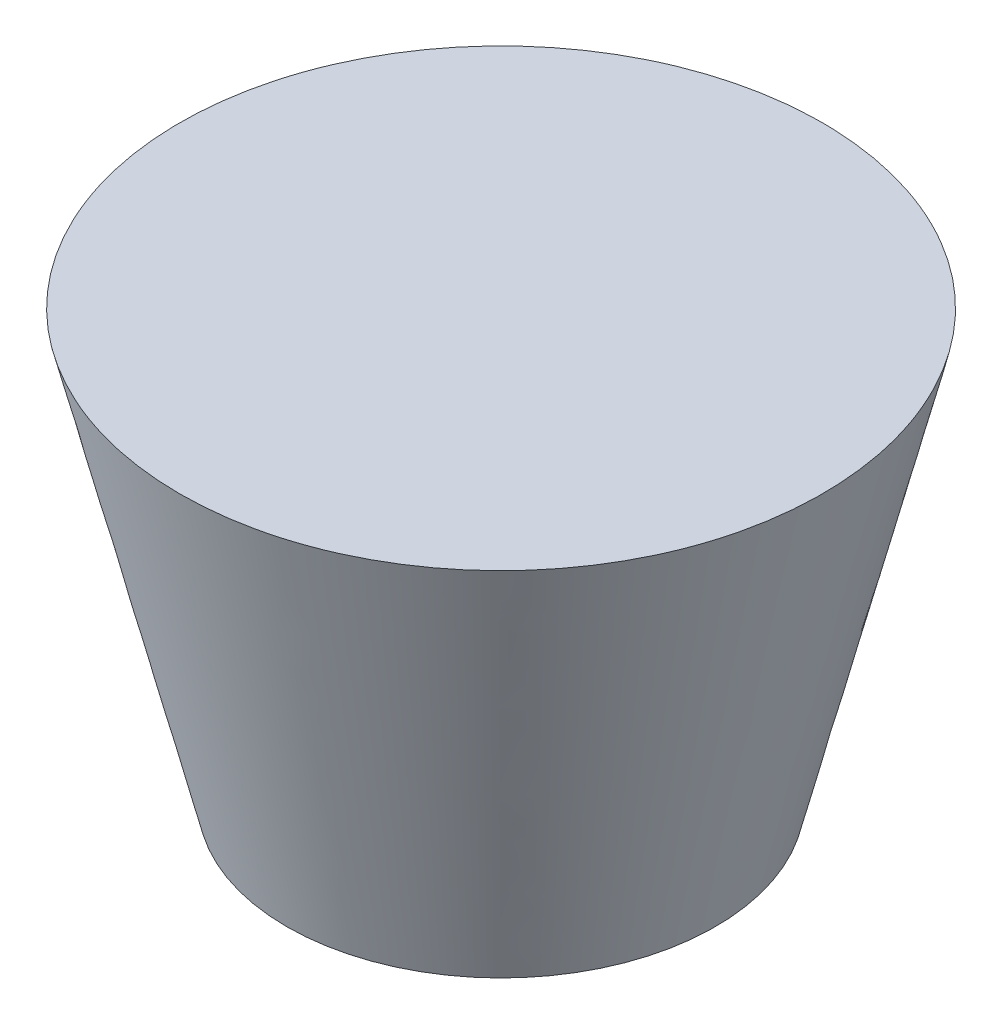
ISO-10303-21;
HEADER;
FILE_DESCRIPTION(('STEP AP214'),'2;1');
FILE_NAME('part.step','',(''),(''),'','','');
FILE_SCHEMA(('AUTOMOTIVE_DESIGN { 1 0 10303 214 1 1 1 1 }'));
ENDSEC;
DATA;
#1=APPLICATION_CONTEXT('core data for automotive mechanical design processes');
#2=APPLICATION_PROTOCOL_DEFINITION('international standard','automotive_design',2000,#1);
#3=PRODUCT_CONTEXT('',#1,'mechanical');
#4=PRODUCT('Part','Part','',(#3));
#5=PRODUCT_RELATED_PRODUCT_CATEGORY('part','',(#4));
#6=PRODUCT_DEFINITION_FORMATION('','',#4);
#7=PRODUCT_DEFINITION_CONTEXT('part definition',#1,'design');
#8=PRODUCT_DEFINITION('design','',#6,#7);
#9=PRODUCT_DEFINITION_SHAPE('','',#8);
#10=(LENGTH_UNIT() NAMED_UNIT(*) SI_UNIT(.MILLI.,.METRE.));
#11=(NAMED_UNIT(*) PLANE_ANGLE_UNIT() SI_UNIT($,.RADIAN.));
#12=(NAMED_UNIT(*) SI_UNIT($,.STERADIAN.) SOLID_ANGLE_UNIT());
#13=UNCERTAINTY_MEASURE_WITH_UNIT(LENGTH_MEASURE(1.E-05),#10,'distance_accuracy_value','');
#14=(GEOMETRIC_REPRESENTATION_CONTEXT(3) GLOBAL_UNCERTAINTY_ASSIGNED_CONTEXT((#13)) GLOBAL_UNIT_ASSIGNED_CONTEXT((#10,
#11,#12)) REPRESENTATION_CONTEXT('',''));
#15=CARTESIAN_POINT('',(0.,0.,0.));
#16=DIRECTION('',(0.,0.,1.));
#17=DIRECTION('',(1.,0.,0.));
#18=AXIS2_PLACEMENT_3D('',#15,#16,#17);
#19=CARTESIAN_POINT('',(0.,0.,0.));
#20=DIRECTION('',(0.,1.,0.));
#21=DIRECTION('',(0.,0.,1.));
#22=AXIS2_PLACEMENT_3D('',#19,#20,#21);
#23=PLANE('',#22);
#24=CARTESIAN_POINT('',(0.,0.,0.));
#25=DIRECTION('',(0.,1.,0.));
#26=DIRECTION('',(0.,0.,1.));
#27=AXIS2_PLACEMENT_3D('',#24,#25,#26);
#28=CIRCLE('',#27,10.);
#29=CARTESIAN_POINT('',(0.,0.,10.));
#30=VERTEX_POINT('',#29);
#31=EDGE_CURVE('E12',#30,#30,#28,.T.);
#32=ORIENTED_EDGE('',*,*,#31,.F.);
#33=EDGE_LOOP('',(#32));
#34=FACE_BOUND('',#33,.T.);
#35=ADVANCED_FACE('F56',(#34),#23,.F.);
#36=CARTESIAN_POINT('',(0.,20.,0.));
#37=DIRECTION('',(0.,1.,0.));
#38=DIRECTION('',(0.,0.,1.));
#39=AXIS2_PLACEMENT_3D('',#36,#37,#38);
#40=PLANE('',#39);
#41=CARTESIAN_POINT('',(0.,20.,0.));
#42=DIRECTION('',(0.,1.,0.));
#43=DIRECTION('',(0.,0.,1.));
#44=AXIS2_PLACEMENT_3D('',#41,#42,#43);
#45=CIRCLE('',#44,15.);
#46=CARTESIAN_POINT('',(0.,20.,15.));
#47=VERTEX_POINT('',#46);
#48=EDGE_CURVE('E64',#47,#47,#45,.T.);
#49=ORIENTED_EDGE('',*,*,#48,.T.);
#50=EDGE_LOOP('',(#49));
#51=FACE_BOUND('',#50,.T.);
#52=ADVANCED_FACE('F88',(#51),#40,.T.);
#53=CARTESIAN_POINT('',(-14.9863897847526,20.,0.));
#54=CARTESIAN_POINT('',(-13.3242598565017,13.3333333333333,0.));
#55=CARTESIAN_POINT('',(-11.6621299282509,6.66666666666666,0.));
#56=CARTESIAN_POINT('',(-10.,0.,0.));
#57=CARTESIAN_POINT('',(-14.9863897847526,20.,-0.413936257442323));
#58=CARTESIAN_POINT('',(-13.3242598565017,13.3333333333333,-0.367943339948732));
#59=CARTESIAN_POINT('',(-11.6621299282509,6.66666666666666,-0.32195042245514));
#60=CARTESIAN_POINT('',(-10.,0.,-0.275957504961552));
#61=CARTESIAN_POINT('',(-14.9527834104968,20.,-1.2340215208385));
#62=CARTESIAN_POINT('',(-13.2943875238299,13.3333333333333,-1.09690801852312));
#63=CARTESIAN_POINT('',(-11.635991637163,6.66666666666666,-0.959794516207726));
#64=CARTESIAN_POINT('',(-9.97759575049615,0.,-0.82268101389234));
#65=CARTESIAN_POINT('',(-14.8054275947609,20.,-2.43691479305229));
#66=CARTESIAN_POINT('',(-13.1634045765091,13.3333333333333,-2.16614648271315));
#67=CARTESIAN_POINT('',(-11.5213815582574,6.66666666666666,-1.89537817237401));
#68=CARTESIAN_POINT('',(-9.87935854000558,0.,-1.62460986203487));
#69=CARTESIAN_POINT('',(-14.564998393088,20.,-3.6087005739705));
#70=CARTESIAN_POINT('',(-12.9496897305776,13.3333333333333,-3.20773384352933));
#71=CARTESIAN_POINT('',(-11.3343810680673,6.66666666666667,-2.80676711308817));
#72=CARTESIAN_POINT('',(-9.71907240555694,0.,-2.405800382647));
#73=CARTESIAN_POINT('',(-12.587220077918,20.,-10.4295331012156));
#74=CARTESIAN_POINT('',(-11.1916645615377,13.3333333333333,-9.27069608996943));
#75=CARTESIAN_POINT('',(-9.79610904515732,6.66666666666666,-8.11185907872326));
#76=CARTESIAN_POINT('',(-8.40055352877699,0.,-6.95302206747709));
#77=CARTESIAN_POINT('',(-6.60936990382972,20.,-15.));
#78=CARTESIAN_POINT('',(-5.87801996234808,13.3333333333333,-13.3333333333333));
#79=CARTESIAN_POINT('',(-5.14667002086644,6.66666666666666,-11.6666666666667));
#80=CARTESIAN_POINT('',(-4.4153200793848,0.,-10.));
#81=CARTESIAN_POINT('',(8.29233536409398,20.,-14.9999999999999));
#82=CARTESIAN_POINT('',(7.36794027580632,13.3333333333333,-13.3333333333333));
#83=CARTESIAN_POINT('',(6.44354518751866,6.66666666666666,-11.6666666666666));
#84=CARTESIAN_POINT('',(5.519150099231,0.,-10.));
#85=CARTESIAN_POINT('',(15.0136102152475,20.,-8.27872514884642));
#86=CARTESIAN_POINT('',(13.342406810165,13.3333333333333,-7.35886679897461));
#87=CARTESIAN_POINT('',(11.6712034050825,6.66666666666666,-6.43900844910281));
#88=CARTESIAN_POINT('',(10.,0.,-5.519150099231));
#89=CARTESIAN_POINT('',(15.0136102152474,20.,8.27872514884657));
#90=CARTESIAN_POINT('',(13.3424068101649,13.3333333333333,7.35886679897472));
#91=CARTESIAN_POINT('',(11.6712034050825,6.66666666666666,6.43900844910286));
#92=CARTESIAN_POINT('',(10.,0.,5.519150099231));
#93=CARTESIAN_POINT('',(8.2923353640939,20.,15.0000000000001));
#94=CARTESIAN_POINT('',(7.36794027580627,13.3333333333333,13.3333333333334));
#95=CARTESIAN_POINT('',(6.44354518751863,6.66666666666666,11.6666666666667));
#96=CARTESIAN_POINT('',(5.519150099231,0.,10.));
#97=CARTESIAN_POINT('',(-6.60936990382979,20.,15.));
#98=CARTESIAN_POINT('',(-5.87801996234813,13.3333333333333,13.3333333333333));
#99=CARTESIAN_POINT('',(-5.14667002086647,6.66666666666666,11.6666666666667));
#100=CARTESIAN_POINT('',(-4.4153200793848,0.,10.));
#101=CARTESIAN_POINT('',(-12.5872200779181,20.,10.4295331012156));
#102=CARTESIAN_POINT('',(-11.1916645615377,13.3333333333333,9.27069608996944));
#103=CARTESIAN_POINT('',(-9.79610904515735,6.66666666666666,8.11185907872326));
#104=CARTESIAN_POINT('',(-8.40055352877699,0.,6.95302206747708));
#105=CARTESIAN_POINT('',(-14.564998393088,20.,3.6087005739705));
#106=CARTESIAN_POINT('',(-12.9496897305776,13.3333333333333,3.20773384352933));
#107=CARTESIAN_POINT('',(-11.3343810680673,6.66666666666666,2.80676711308817));
#108=CARTESIAN_POINT('',(-9.71907240555694,0.,2.405800382647));
#109=CARTESIAN_POINT('',(-14.8054275947609,20.,2.43691479305229));
#110=CARTESIAN_POINT('',(-13.1634045765092,13.3333333333333,2.16614648271315));
#111=CARTESIAN_POINT('',(-11.5213815582574,6.66666666666666,1.89537817237401));
#112=CARTESIAN_POINT('',(-9.87935854000558,0.,1.62460986203486));
#113=CARTESIAN_POINT('',(-14.9527834104968,20.,1.23402152083851));
#114=CARTESIAN_POINT('',(-13.2943875238299,13.3333333333333,1.09690801852312));
#115=CARTESIAN_POINT('',(-11.635991637163,6.66666666666666,0.959794516207729));
#116=CARTESIAN_POINT('',(-9.97759575049615,0.,0.822681013892337));
#117=CARTESIAN_POINT('',(-14.9863897847526,20.,0.413936257442323));
#118=CARTESIAN_POINT('',(-13.3242598565017,13.3333333333333,0.367943339948732));
#119=CARTESIAN_POINT('',(-11.6621299282509,6.66666666666666,0.32195042245514));
#120=CARTESIAN_POINT('',(-10.,0.,0.275957504961546));
#121=CARTESIAN_POINT('',(-14.9863897847526,20.,0.));
#122=CARTESIAN_POINT('',(-13.3242598565017,13.3333333333333,0.));
#123=CARTESIAN_POINT('',(-11.6621299282509,6.66666666666666,0.));
#124=CARTESIAN_POINT('',(-10.,0.,0.));
#125=B_SPLINE_SURFACE_WITH_KNOTS('',3,3,((#53,#54,#55,#56),(#57,#58,#59,#60),(#61,#62,#63,#64),
(#65,#66,#67,#68),(#69,#70,#71,#72),(#73,#74,#75,#76),(#77,#78,#79,#80),(#81,#82,#83,#84),(#85,
#86,#87,#88),(#89,#90,#91,#92),(#93,#94,#95,#96),(#97,#98,#99,#100),(#101,#102,#103,#104),(#105,
#106,#107,#108),(#109,#110,#111,#112),(#113,#114,#115,#116),(#117,#118,#119,#120),(#121,#122,
#123,#124)),.UNSPECIFIED.,.T.,.F.,.F.,(4,1,1,1,1,2,2,2,1,1,1,1,4),(4,4),(0.,0.0125,
0.0249999999999999,0.0375000000000001,0.05,0.25,0.5,0.75,0.95,0.9625,0.975,0.9875,1.),(0.,1.),.UNSPECIFIED.);
#126=ORIENTED_EDGE('',*,*,#48,.F.);
#127=EDGE_LOOP('',(#126));
#128=FACE_BOUND('',#127,.T.);
#129=ORIENTED_EDGE('',*,*,#31,.T.);
#130=EDGE_LOOP('',(#129));
#131=FACE_BOUND('',#130,.T.);
#132=ADVANCED_FACE('F96',(#128,#131),#125,.T.);
#133=CLOSED_SHELL('',(#35,#52,#132));
#134=MANIFOLD_SOLID_BREP('B2',#133);
#135=ADVANCED_BREP_SHAPE_REPRESENTATION('',(#18,#134),#14);
#136=SHAPE_DEFINITION_REPRESENTATION(#9,#135);
ENDSEC;
END-ISO-10303-21;
